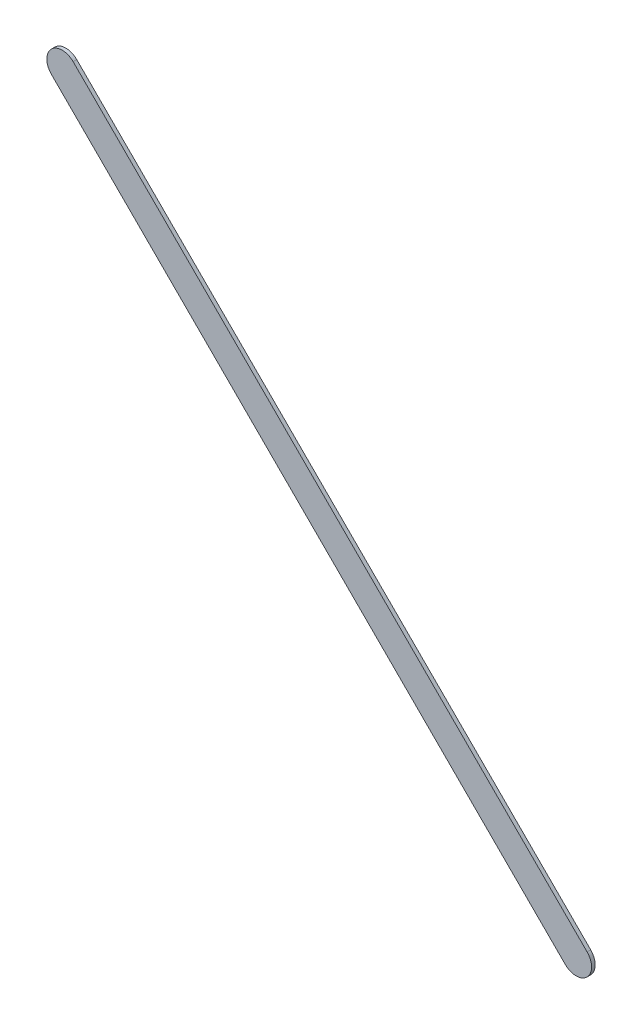
ISO-10303-21;
HEADER;
FILE_DESCRIPTION(('STEP AP214'),'2;1');
FILE_NAME('part.step','',(''),(''),'','','');
FILE_SCHEMA(('AUTOMOTIVE_DESIGN { 1 0 10303 214 1 1 1 1 }'));
ENDSEC;
DATA;
#1=APPLICATION_CONTEXT('core data for automotive mechanical design processes');
#2=APPLICATION_PROTOCOL_DEFINITION('international standard','automotive_design',2000,#1);
#3=PRODUCT_CONTEXT('',#1,'mechanical');
#4=PRODUCT('Part','Part','',(#3));
#5=PRODUCT_RELATED_PRODUCT_CATEGORY('part','',(#4));
#6=PRODUCT_DEFINITION_FORMATION('','',#4);
#7=PRODUCT_DEFINITION_CONTEXT('part definition',#1,'design');
#8=PRODUCT_DEFINITION('design','',#6,#7);
#9=PRODUCT_DEFINITION_SHAPE('','',#8);
#10=(LENGTH_UNIT() NAMED_UNIT(*) SI_UNIT(.MILLI.,.METRE.));
#11=(NAMED_UNIT(*) PLANE_ANGLE_UNIT() SI_UNIT($,.RADIAN.));
#12=(NAMED_UNIT(*) SI_UNIT($,.STERADIAN.) SOLID_ANGLE_UNIT());
#13=UNCERTAINTY_MEASURE_WITH_UNIT(LENGTH_MEASURE(1.E-05),#10,'distance_accuracy_value','');
#14=(GEOMETRIC_REPRESENTATION_CONTEXT(3) GLOBAL_UNCERTAINTY_ASSIGNED_CONTEXT((#13)) GLOBAL_UNIT_ASSIGNED_CONTEXT((#10,
#11,#12)) REPRESENTATION_CONTEXT('',''));
#15=CARTESIAN_POINT('',(0.,0.,0.));
#16=DIRECTION('',(0.,0.,1.));
#17=DIRECTION('',(1.,0.,0.));
#18=AXIS2_PLACEMENT_3D('',#15,#16,#17);
#19=CARTESIAN_POINT('',(134.603933,-68.606066,1.635));
#20=DIRECTION('',(0.,0.,1.));
#21=DIRECTION('',(1.,0.,0.));
#22=AXIS2_PLACEMENT_3D('',#19,#20,#21);
#23=PLANE('',#22);
#24=DIRECTION('',(0.707106781186548,-0.707106781186548,0.));
#25=VECTOR('',#24,1.);
#26=CARTESIAN_POINT('',(134.603933,-68.606066,1.635));
#27=LINE('',#26,#25);
#28=CARTESIAN_POINT('',(134.603933,-68.606066,1.635));
#29=VERTEX_POINT('',#28);
#30=CARTESIAN_POINT('',(139.603933,-73.606066,1.635));
#31=VERTEX_POINT('',#30);
#32=EDGE_CURVE('E79',#29,#31,#27,.T.);
#33=ORIENTED_EDGE('',*,*,#32,.T.);
#34=CARTESIAN_POINT('',(139.7099995,-73.4999995,1.635));
#35=DIRECTION('',(0.,0.,1.));
#36=DIRECTION('',(-0.707106781186548,-0.707106781186548,0.));
#37=AXIS2_PLACEMENT_3D('',#34,#35,#36);
#38=CIRCLE('',#37,0.150000682813);
#39=CARTESIAN_POINT('',(139.816066,-73.393933,1.635));
#40=VERTEX_POINT('',#39);
#41=EDGE_CURVE('E77',#31,#40,#38,.T.);
#42=ORIENTED_EDGE('',*,*,#41,.T.);
#43=DIRECTION('',(-0.707106781186548,0.707106781186548,0.));
#44=VECTOR('',#43,1.);
#45=CARTESIAN_POINT('',(139.816066,-73.393933,1.635));
#46=LINE('',#45,#44);
#47=CARTESIAN_POINT('',(134.816066,-68.393933,1.635));
#48=VERTEX_POINT('',#47);
#49=EDGE_CURVE('E65',#40,#48,#46,.T.);
#50=ORIENTED_EDGE('',*,*,#49,.T.);
#51=CARTESIAN_POINT('',(134.7099995,-68.4999995,1.635));
#52=DIRECTION('',(0.,0.,1.));
#53=DIRECTION('',(0.707106781186548,0.707106781186548,0.));
#54=AXIS2_PLACEMENT_3D('',#51,#52,#53);
#55=CIRCLE('',#54,0.150000682813);
#56=EDGE_CURVE('E11',#48,#29,#55,.T.);
#57=ORIENTED_EDGE('',*,*,#56,.T.);
#58=EDGE_LOOP('',(#33,#42,#50,#57));
#59=FACE_BOUND('',#58,.T.);
#60=ADVANCED_FACE('F17',(#59),#23,.T.);
#61=CARTESIAN_POINT('',(134.603933,-68.606066,1.6));
#62=DIRECTION('',(0.,0.,1.));
#63=DIRECTION('',(1.,0.,0.));
#64=AXIS2_PLACEMENT_3D('',#61,#62,#63);
#65=PLANE('',#64);
#66=CARTESIAN_POINT('',(134.7099995,-68.4999995,1.6));
#67=DIRECTION('',(0.,0.,1.));
#68=DIRECTION('',(0.707106781186548,0.707106781186548,0.));
#69=AXIS2_PLACEMENT_3D('',#66,#67,#68);
#70=CIRCLE('',#69,0.150000682813);
#71=CARTESIAN_POINT('',(134.816066,-68.393933,1.6));
#72=VERTEX_POINT('',#71);
#73=CARTESIAN_POINT('',(134.603933,-68.606066,1.6));
#74=VERTEX_POINT('',#73);
#75=EDGE_CURVE('E21',#72,#74,#70,.T.);
#76=ORIENTED_EDGE('',*,*,#75,.F.);
#77=DIRECTION('',(-0.707106781186548,0.707106781186548,0.));
#78=VECTOR('',#77,1.);
#79=CARTESIAN_POINT('',(139.816066,-73.393933,1.6));
#80=LINE('',#79,#78);
#81=CARTESIAN_POINT('',(139.816066,-73.393933,1.6));
#82=VERTEX_POINT('',#81);
#83=EDGE_CURVE('E58',#82,#72,#80,.T.);
#84=ORIENTED_EDGE('',*,*,#83,.F.);
#85=CARTESIAN_POINT('',(139.7099995,-73.4999995,1.6));
#86=DIRECTION('',(0.,0.,1.));
#87=DIRECTION('',(-0.707106781186548,-0.707106781186548,0.));
#88=AXIS2_PLACEMENT_3D('',#85,#86,#87);
#89=CIRCLE('',#88,0.150000682813);
#90=CARTESIAN_POINT('',(139.603933,-73.606066,1.6));
#91=VERTEX_POINT('',#90);
#92=EDGE_CURVE('E86',#91,#82,#89,.T.);
#93=ORIENTED_EDGE('',*,*,#92,.F.);
#94=DIRECTION('',(0.707106781186548,-0.707106781186548,0.));
#95=VECTOR('',#94,1.);
#96=CARTESIAN_POINT('',(134.603933,-68.606066,1.6));
#97=LINE('',#96,#95);
#98=EDGE_CURVE('E135',#74,#91,#97,.T.);
#99=ORIENTED_EDGE('',*,*,#98,.F.);
#100=EDGE_LOOP('',(#76,#84,#93,#99));
#101=FACE_BOUND('',#100,.T.);
#102=ADVANCED_FACE('F19',(#101),#65,.F.);
#103=CARTESIAN_POINT('',(134.7099995,-68.4999995,1.6));
#104=DIRECTION('',(0.,0.,-1.));
#105=DIRECTION('',(0.707106781186548,0.707106781186548,0.));
#106=AXIS2_PLACEMENT_3D('',#103,#104,#105);
#107=CYLINDRICAL_SURFACE('',#106,0.150000682813);
#108=ORIENTED_EDGE('',*,*,#75,.T.);
#109=DIRECTION('',(0.,0.,1.));
#110=VECTOR('',#109,1.);
#111=CARTESIAN_POINT('',(134.603933,-68.606066,1.6));
#112=LINE('',#111,#110);
#113=EDGE_CURVE('E93',#74,#29,#112,.T.);
#114=ORIENTED_EDGE('',*,*,#113,.T.);
#115=ORIENTED_EDGE('',*,*,#56,.F.);
#116=DIRECTION('',(0.,0.,1.));
#117=VECTOR('',#116,1.);
#118=CARTESIAN_POINT('',(134.816066,-68.393933,1.6));
#119=LINE('',#118,#117);
#120=EDGE_CURVE('E71',#72,#48,#119,.T.);
#121=ORIENTED_EDGE('',*,*,#120,.F.);
#122=EDGE_LOOP('',(#108,#114,#115,#121));
#123=FACE_BOUND('',#122,.T.);
#124=ADVANCED_FACE('F156',(#123),#107,.T.);
#125=CARTESIAN_POINT('',(139.816066,-73.393933,1.6));
#126=DIRECTION('',(-0.707106781186548,-0.707106781186548,0.));
#127=DIRECTION('',(-0.707106781186548,0.707106781186548,0.));
#128=AXIS2_PLACEMENT_3D('',#125,#126,#127);
#129=PLANE('',#128);
#130=ORIENTED_EDGE('',*,*,#83,.T.);
#131=ORIENTED_EDGE('',*,*,#120,.T.);
#132=ORIENTED_EDGE('',*,*,#49,.F.);
#133=DIRECTION('',(0.,0.,1.));
#134=VECTOR('',#133,1.);
#135=CARTESIAN_POINT('',(139.816066,-73.393933,1.6));
#136=LINE('',#135,#134);
#137=EDGE_CURVE('E69',#82,#40,#136,.T.);
#138=ORIENTED_EDGE('',*,*,#137,.F.);
#139=EDGE_LOOP('',(#130,#131,#132,#138));
#140=FACE_BOUND('',#139,.T.);
#141=ADVANCED_FACE('F67',(#140),#129,.F.);
#142=CARTESIAN_POINT('',(139.7099995,-73.4999995,1.6));
#143=DIRECTION('',(0.,0.,-1.));
#144=DIRECTION('',(-0.707106781186548,-0.707106781186548,0.));
#145=AXIS2_PLACEMENT_3D('',#142,#143,#144);
#146=CYLINDRICAL_SURFACE('',#145,0.150000682813);
#147=ORIENTED_EDGE('',*,*,#92,.T.);
#148=ORIENTED_EDGE('',*,*,#137,.T.);
#149=ORIENTED_EDGE('',*,*,#41,.F.);
#150=DIRECTION('',(0.,0.,1.));
#151=VECTOR('',#150,1.);
#152=CARTESIAN_POINT('',(139.603933,-73.606066,1.6));
#153=LINE('',#152,#151);
#154=EDGE_CURVE('E129',#91,#31,#153,.T.);
#155=ORIENTED_EDGE('',*,*,#154,.F.);
#156=EDGE_LOOP('',(#147,#148,#149,#155));
#157=FACE_BOUND('',#156,.T.);
#158=ADVANCED_FACE('F85',(#157),#146,.T.);
#159=CARTESIAN_POINT('',(134.603933,-68.606066,1.6));
#160=DIRECTION('',(0.707106781186548,0.707106781186548,0.));
#161=DIRECTION('',(0.,0.,-1.));
#162=AXIS2_PLACEMENT_3D('',#159,#160,#161);
#163=PLANE('',#162);
#164=ORIENTED_EDGE('',*,*,#98,.T.);
#165=ORIENTED_EDGE('',*,*,#154,.T.);
#166=ORIENTED_EDGE('',*,*,#32,.F.);
#167=ORIENTED_EDGE('',*,*,#113,.F.);
#168=EDGE_LOOP('',(#164,#165,#166,#167));
#169=FACE_BOUND('',#168,.T.);
#170=ADVANCED_FACE('F146',(#169),#163,.F.);
#171=CLOSED_SHELL('',(#60,#102,#124,#141,#158,#170));
#172=MANIFOLD_SOLID_BREP('B1',#171);
#173=ADVANCED_BREP_SHAPE_REPRESENTATION('',(#18,#172),#14);
#174=SHAPE_DEFINITION_REPRESENTATION(#9,#173);
ENDSEC;
END-ISO-10303-21;
